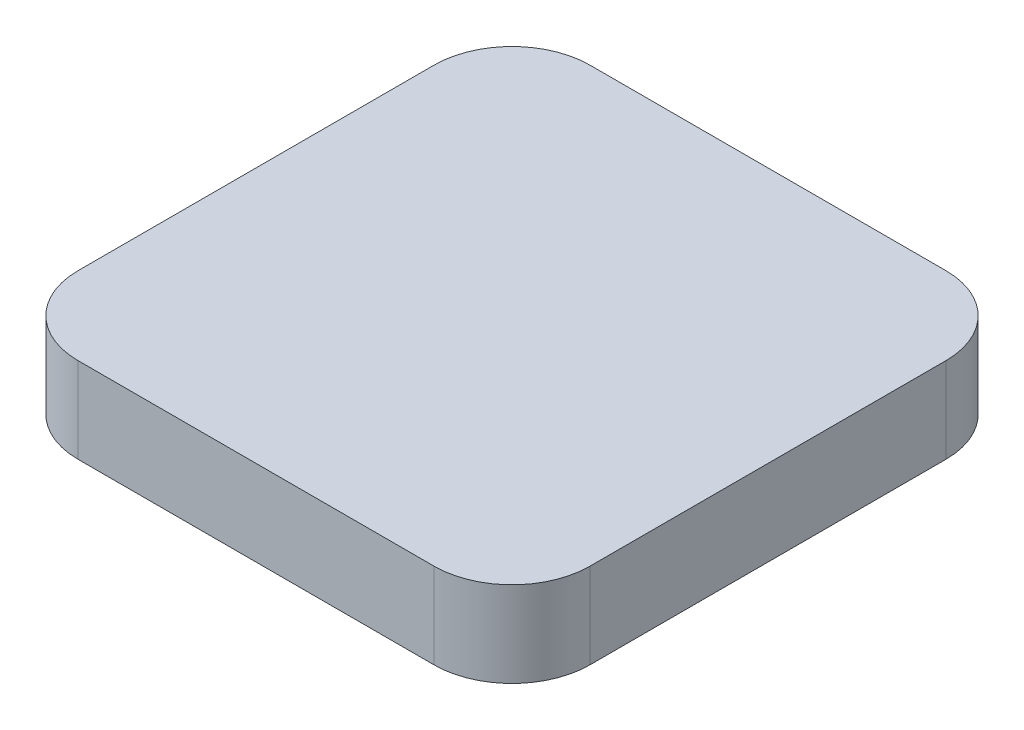
ISO-10303-21;
HEADER;
FILE_DESCRIPTION(('STEP AP214'),'2;1');
FILE_NAME('part.step','',(''),(''),'','','');
FILE_SCHEMA(('AUTOMOTIVE_DESIGN { 1 0 10303 214 1 1 1 1 }'));
ENDSEC;
DATA;
#1=APPLICATION_CONTEXT('core data for automotive mechanical design processes');
#2=APPLICATION_PROTOCOL_DEFINITION('international standard','automotive_design',2000,#1);
#3=PRODUCT_CONTEXT('',#1,'mechanical');
#4=PRODUCT('Part','Part','',(#3));
#5=PRODUCT_RELATED_PRODUCT_CATEGORY('part','',(#4));
#6=PRODUCT_DEFINITION_FORMATION('','',#4);
#7=PRODUCT_DEFINITION_CONTEXT('part definition',#1,'design');
#8=PRODUCT_DEFINITION('design','',#6,#7);
#9=PRODUCT_DEFINITION_SHAPE('','',#8);
#10=(LENGTH_UNIT() NAMED_UNIT(*) SI_UNIT(.MILLI.,.METRE.));
#11=(NAMED_UNIT(*) PLANE_ANGLE_UNIT() SI_UNIT($,.RADIAN.));
#12=(NAMED_UNIT(*) SI_UNIT($,.STERADIAN.) SOLID_ANGLE_UNIT());
#13=UNCERTAINTY_MEASURE_WITH_UNIT(LENGTH_MEASURE(1.E-05),#10,'distance_accuracy_value','');
#14=(GEOMETRIC_REPRESENTATION_CONTEXT(3) GLOBAL_UNCERTAINTY_ASSIGNED_CONTEXT((#13)) GLOBAL_UNIT_ASSIGNED_CONTEXT((#10,
#11,#12)) REPRESENTATION_CONTEXT('',''));
#15=CARTESIAN_POINT('',(0.,0.,0.));
#16=DIRECTION('',(0.,0.,1.));
#17=DIRECTION('',(1.,0.,0.));
#18=AXIS2_PLACEMENT_3D('',#15,#16,#17);
#19=CARTESIAN_POINT('',(-8.69949999999992,4.1783,8.69950000000003));
#20=DIRECTION('',(0.,-1.,0.));
#21=DIRECTION('',(0.,0.,-1.));
#22=AXIS2_PLACEMENT_3D('',#19,#20,#21);
#23=CYLINDRICAL_SURFACE('',#22,3.80999999999998);
#24=CARTESIAN_POINT('',(-8.69949999999992,0.,8.69950000000003));
#25=DIRECTION('',(0.,1.,0.));
#26=DIRECTION('',(0.,0.,-1.));
#27=AXIS2_PLACEMENT_3D('',#24,#25,#26);
#28=CIRCLE('',#27,3.80999999999998);
#29=CARTESIAN_POINT('',(-12.5094999999999,0.,8.69950000000003));
#30=VERTEX_POINT('',#29);
#31=CARTESIAN_POINT('',(-8.69949999999992,0.,12.5095));
#32=VERTEX_POINT('',#31);
#33=EDGE_CURVE('E128',#30,#32,#28,.T.);
#34=ORIENTED_EDGE('',*,*,#33,.T.);
#35=DIRECTION('',(0.,-1.,0.));
#36=VECTOR('',#35,1.);
#37=CARTESIAN_POINT('',(-8.69949999999992,4.1783,12.5095));
#38=LINE('',#37,#36);
#39=CARTESIAN_POINT('',(-8.69949999999992,4.1783,12.5095));
#40=VERTEX_POINT('',#39);
#41=EDGE_CURVE('E11',#40,#32,#38,.T.);
#42=ORIENTED_EDGE('',*,*,#41,.F.);
#43=CARTESIAN_POINT('',(-8.69949999999992,4.1783,8.69950000000003));
#44=DIRECTION('',(0.,1.,0.));
#45=DIRECTION('',(0.,0.,-1.));
#46=AXIS2_PLACEMENT_3D('',#43,#44,#45);
#47=CIRCLE('',#46,3.80999999999998);
#48=CARTESIAN_POINT('',(-12.5094999999999,4.1783,8.69950000000003));
#49=VERTEX_POINT('',#48);
#50=EDGE_CURVE('E142',#49,#40,#47,.T.);
#51=ORIENTED_EDGE('',*,*,#50,.F.);
#52=DIRECTION('',(0.,-1.,0.));
#53=VECTOR('',#52,1.);
#54=CARTESIAN_POINT('',(-12.5094999999999,4.1783,8.69950000000003));
#55=LINE('',#54,#53);
#56=EDGE_CURVE('E124',#49,#30,#55,.T.);
#57=ORIENTED_EDGE('',*,*,#56,.T.);
#58=EDGE_LOOP('',(#34,#42,#51,#57));
#59=FACE_BOUND('',#58,.T.);
#60=ADVANCED_FACE('F32',(#59),#23,.T.);
#61=CARTESIAN_POINT('',(-8.69949999999992,4.1783,12.5095));
#62=DIRECTION('',(0.,0.,-1.));
#63=DIRECTION('',(-1.,0.,0.));
#64=AXIS2_PLACEMENT_3D('',#61,#62,#63);
#65=PLANE('',#64);
#66=DIRECTION('',(1.,0.,0.));
#67=VECTOR('',#66,1.);
#68=CARTESIAN_POINT('',(-8.69949999999992,0.,12.5095));
#69=LINE('',#68,#67);
#70=CARTESIAN_POINT('',(8.69950000000014,0.,12.5095));
#71=VERTEX_POINT('',#70);
#72=EDGE_CURVE('E131',#32,#71,#69,.T.);
#73=ORIENTED_EDGE('',*,*,#72,.T.);
#74=DIRECTION('',(0.,-1.,0.));
#75=VECTOR('',#74,1.);
#76=CARTESIAN_POINT('',(8.69950000000014,4.1783,12.5095));
#77=LINE('',#76,#75);
#78=CARTESIAN_POINT('',(8.69950000000014,4.1783,12.5095));
#79=VERTEX_POINT('',#78);
#80=EDGE_CURVE('E40',#79,#71,#77,.T.);
#81=ORIENTED_EDGE('',*,*,#80,.F.);
#82=DIRECTION('',(1.,0.,0.));
#83=VECTOR('',#82,1.);
#84=CARTESIAN_POINT('',(-8.69949999999992,4.1783,12.5095));
#85=LINE('',#84,#83);
#86=EDGE_CURVE('E91',#40,#79,#85,.T.);
#87=ORIENTED_EDGE('',*,*,#86,.F.);
#88=ORIENTED_EDGE('',*,*,#41,.T.);
#89=EDGE_LOOP('',(#73,#81,#87,#88));
#90=FACE_BOUND('',#89,.T.);
#91=ADVANCED_FACE('F177',(#90),#65,.F.);
#92=CARTESIAN_POINT('',(8.69950000000014,4.1783,8.69950000000003));
#93=DIRECTION('',(0.,-1.,0.));
#94=DIRECTION('',(0.,0.,-1.));
#95=AXIS2_PLACEMENT_3D('',#92,#93,#94);
#96=CYLINDRICAL_SURFACE('',#95,3.80999999999998);
#97=CARTESIAN_POINT('',(8.69950000000014,0.,8.69950000000003));
#98=DIRECTION('',(0.,1.,0.));
#99=DIRECTION('',(0.,0.,1.));
#100=AXIS2_PLACEMENT_3D('',#97,#98,#99);
#101=CIRCLE('',#100,3.80999999999998);
#102=CARTESIAN_POINT('',(12.5095000000001,0.,8.69950000000003));
#103=VERTEX_POINT('',#102);
#104=EDGE_CURVE('E133',#71,#103,#101,.T.);
#105=ORIENTED_EDGE('',*,*,#104,.T.);
#106=DIRECTION('',(0.,-1.,0.));
#107=VECTOR('',#106,1.);
#108=CARTESIAN_POINT('',(12.5095000000001,4.1783,8.69950000000003));
#109=LINE('',#108,#107);
#110=CARTESIAN_POINT('',(12.5095000000001,4.1783,8.69950000000003));
#111=VERTEX_POINT('',#110);
#112=EDGE_CURVE('E149',#111,#103,#109,.T.);
#113=ORIENTED_EDGE('',*,*,#112,.F.);
#114=CARTESIAN_POINT('',(8.69950000000014,4.1783,8.69950000000003));
#115=DIRECTION('',(0.,1.,0.));
#116=DIRECTION('',(0.,0.,1.));
#117=AXIS2_PLACEMENT_3D('',#114,#115,#116);
#118=CIRCLE('',#117,3.80999999999998);
#119=EDGE_CURVE('E157',#79,#111,#118,.T.);
#120=ORIENTED_EDGE('',*,*,#119,.F.);
#121=ORIENTED_EDGE('',*,*,#80,.T.);
#122=EDGE_LOOP('',(#105,#113,#120,#121));
#123=FACE_BOUND('',#122,.T.);
#124=ADVANCED_FACE('F155',(#123),#96,.T.);
#125=CARTESIAN_POINT('',(12.5095000000001,4.1783,8.69950000000003));
#126=DIRECTION('',(-1.,0.,0.));
#127=DIRECTION('',(0.,0.,1.));
#128=AXIS2_PLACEMENT_3D('',#125,#126,#127);
#129=PLANE('',#128);
#130=DIRECTION('',(0.,0.,-1.));
#131=VECTOR('',#130,1.);
#132=CARTESIAN_POINT('',(12.5095000000001,0.,8.69950000000003));
#133=LINE('',#132,#131);
#134=CARTESIAN_POINT('',(12.5095000000001,0.,-8.69950000000003));
#135=VERTEX_POINT('',#134);
#136=EDGE_CURVE('E135',#103,#135,#133,.T.);
#137=ORIENTED_EDGE('',*,*,#136,.T.);
#138=DIRECTION('',(0.,-1.,0.));
#139=VECTOR('',#138,1.);
#140=CARTESIAN_POINT('',(12.5095000000001,4.1783,-8.69950000000003));
#141=LINE('',#140,#139);
#142=CARTESIAN_POINT('',(12.5095000000001,4.1783,-8.69950000000003));
#143=VERTEX_POINT('',#142);
#144=EDGE_CURVE('E146',#143,#135,#141,.T.);
#145=ORIENTED_EDGE('',*,*,#144,.F.);
#146=DIRECTION('',(0.,0.,-1.));
#147=VECTOR('',#146,1.);
#148=CARTESIAN_POINT('',(12.5095000000001,4.1783,8.69950000000003));
#149=LINE('',#148,#147);
#150=EDGE_CURVE('E169',#111,#143,#149,.T.);
#151=ORIENTED_EDGE('',*,*,#150,.F.);
#152=ORIENTED_EDGE('',*,*,#112,.T.);
#153=EDGE_LOOP('',(#137,#145,#151,#152));
#154=FACE_BOUND('',#153,.T.);
#155=ADVANCED_FACE('F165',(#154),#129,.F.);
#156=CARTESIAN_POINT('',(8.69950000000014,4.1783,-8.69950000000003));
#157=DIRECTION('',(0.,-1.,0.));
#158=DIRECTION('',(0.,0.,-1.));
#159=AXIS2_PLACEMENT_3D('',#156,#157,#158);
#160=CYLINDRICAL_SURFACE('',#159,3.80999999999998);
#161=CARTESIAN_POINT('',(8.69950000000014,0.,-8.69950000000003));
#162=DIRECTION('',(0.,1.,0.));
#163=DIRECTION('',(0.,0.,-1.));
#164=AXIS2_PLACEMENT_3D('',#161,#162,#163);
#165=CIRCLE('',#164,3.80999999999998);
#166=CARTESIAN_POINT('',(8.69950000000014,0.,-12.5095));
#167=VERTEX_POINT('',#166);
#168=EDGE_CURVE('E137',#135,#167,#165,.T.);
#169=ORIENTED_EDGE('',*,*,#168,.T.);
#170=DIRECTION('',(0.,-1.,0.));
#171=VECTOR('',#170,1.);
#172=CARTESIAN_POINT('',(8.69950000000014,4.1783,-12.5095));
#173=LINE('',#172,#171);
#174=CARTESIAN_POINT('',(8.69950000000014,4.1783,-12.5095));
#175=VERTEX_POINT('',#174);
#176=EDGE_CURVE('E119',#175,#167,#173,.T.);
#177=ORIENTED_EDGE('',*,*,#176,.F.);
#178=CARTESIAN_POINT('',(8.69950000000014,4.1783,-8.69950000000003));
#179=DIRECTION('',(0.,1.,0.));
#180=DIRECTION('',(0.,0.,-1.));
#181=AXIS2_PLACEMENT_3D('',#178,#179,#180);
#182=CIRCLE('',#181,3.80999999999998);
#183=EDGE_CURVE('E110',#143,#175,#182,.T.);
#184=ORIENTED_EDGE('',*,*,#183,.F.);
#185=ORIENTED_EDGE('',*,*,#144,.T.);
#186=EDGE_LOOP('',(#169,#177,#184,#185));
#187=FACE_BOUND('',#186,.T.);
#188=ADVANCED_FACE('F168',(#187),#160,.T.);
#189=CARTESIAN_POINT('',(-8.69949999999992,4.1783,-12.5095));
#190=DIRECTION('',(0.,0.,1.));
#191=DIRECTION('',(1.,0.,0.));
#192=AXIS2_PLACEMENT_3D('',#189,#190,#191);
#193=PLANE('',#192);
#194=DIRECTION('',(-1.,0.,0.));
#195=VECTOR('',#194,1.);
#196=CARTESIAN_POINT('',(-8.69949999999992,0.,-12.5095));
#197=LINE('',#196,#195);
#198=CARTESIAN_POINT('',(-8.69949999999992,0.,-12.5095));
#199=VERTEX_POINT('',#198);
#200=EDGE_CURVE('E118',#167,#199,#197,.T.);
#201=ORIENTED_EDGE('',*,*,#200,.T.);
#202=DIRECTION('',(0.,-1.,0.));
#203=VECTOR('',#202,1.);
#204=CARTESIAN_POINT('',(-8.69949999999992,4.1783,-12.5095));
#205=LINE('',#204,#203);
#206=CARTESIAN_POINT('',(-8.69949999999992,4.1783,-12.5095));
#207=VERTEX_POINT('',#206);
#208=EDGE_CURVE('E115',#207,#199,#205,.T.);
#209=ORIENTED_EDGE('',*,*,#208,.F.);
#210=DIRECTION('',(-1.,0.,0.));
#211=VECTOR('',#210,1.);
#212=CARTESIAN_POINT('',(-8.69949999999992,4.1783,-12.5095));
#213=LINE('',#212,#211);
#214=EDGE_CURVE('E104',#175,#207,#213,.T.);
#215=ORIENTED_EDGE('',*,*,#214,.F.);
#216=ORIENTED_EDGE('',*,*,#176,.T.);
#217=EDGE_LOOP('',(#201,#209,#215,#216));
#218=FACE_BOUND('',#217,.T.);
#219=ADVANCED_FACE('F116',(#218),#193,.F.);
#220=CARTESIAN_POINT('',(-8.69949999999992,4.1783,-8.69950000000003));
#221=DIRECTION('',(0.,-1.,0.));
#222=DIRECTION('',(0.,0.,-1.));
#223=AXIS2_PLACEMENT_3D('',#220,#221,#222);
#224=CYLINDRICAL_SURFACE('',#223,3.80999999999998);
#225=CARTESIAN_POINT('',(-8.69949999999992,0.,-8.69950000000003));
#226=DIRECTION('',(0.,1.,0.));
#227=DIRECTION('',(0.,0.,-1.));
#228=AXIS2_PLACEMENT_3D('',#225,#226,#227);
#229=CIRCLE('',#228,3.80999999999998);
#230=CARTESIAN_POINT('',(-12.5094999999999,0.,-8.69950000000003));
#231=VERTEX_POINT('',#230);
#232=EDGE_CURVE('E77',#199,#231,#229,.T.);
#233=ORIENTED_EDGE('',*,*,#232,.T.);
#234=DIRECTION('',(0.,-1.,0.));
#235=VECTOR('',#234,1.);
#236=CARTESIAN_POINT('',(-12.5094999999999,4.1783,-8.69950000000003));
#237=LINE('',#236,#235);
#238=CARTESIAN_POINT('',(-12.5094999999999,4.1783,-8.69950000000003));
#239=VERTEX_POINT('',#238);
#240=EDGE_CURVE('E120',#239,#231,#237,.T.);
#241=ORIENTED_EDGE('',*,*,#240,.F.);
#242=CARTESIAN_POINT('',(-8.69949999999992,4.1783,-8.69950000000003));
#243=DIRECTION('',(0.,1.,0.));
#244=DIRECTION('',(0.,0.,-1.));
#245=AXIS2_PLACEMENT_3D('',#242,#243,#244);
#246=CIRCLE('',#245,3.80999999999998);
#247=EDGE_CURVE('E108',#207,#239,#246,.T.);
#248=ORIENTED_EDGE('',*,*,#247,.F.);
#249=ORIENTED_EDGE('',*,*,#208,.T.);
#250=EDGE_LOOP('',(#233,#241,#248,#249));
#251=FACE_BOUND('',#250,.T.);
#252=ADVANCED_FACE('F122',(#251),#224,.T.);
#253=CARTESIAN_POINT('',(-12.5094999999999,4.1783,8.69950000000003));
#254=DIRECTION('',(1.,0.,0.));
#255=DIRECTION('',(0.,0.,-1.));
#256=AXIS2_PLACEMENT_3D('',#253,#254,#255);
#257=PLANE('',#256);
#258=DIRECTION('',(0.,0.,1.));
#259=VECTOR('',#258,1.);
#260=CARTESIAN_POINT('',(-12.5094999999999,0.,8.69950000000003));
#261=LINE('',#260,#259);
#262=EDGE_CURVE('E83',#231,#30,#261,.T.);
#263=ORIENTED_EDGE('',*,*,#262,.T.);
#264=ORIENTED_EDGE('',*,*,#56,.F.);
#265=DIRECTION('',(0.,0.,1.));
#266=VECTOR('',#265,1.);
#267=CARTESIAN_POINT('',(-12.5094999999999,4.1783,8.69950000000003));
#268=LINE('',#267,#266);
#269=EDGE_CURVE('E48',#239,#49,#268,.T.);
#270=ORIENTED_EDGE('',*,*,#269,.F.);
#271=ORIENTED_EDGE('',*,*,#240,.T.);
#272=EDGE_LOOP('',(#263,#264,#270,#271));
#273=FACE_BOUND('',#272,.T.);
#274=ADVANCED_FACE('F193',(#273),#257,.F.);
#275=CARTESIAN_POINT('',(-8.69949999999992,4.1783,8.69950000000003));
#276=DIRECTION('',(0.,-1.,0.));
#277=DIRECTION('',(0.,0.,-1.));
#278=AXIS2_PLACEMENT_3D('',#275,#276,#277);
#279=PLANE('',#278);
#280=ORIENTED_EDGE('',*,*,#50,.T.);
#281=ORIENTED_EDGE('',*,*,#86,.T.);
#282=ORIENTED_EDGE('',*,*,#119,.T.);
#283=ORIENTED_EDGE('',*,*,#150,.T.);
#284=ORIENTED_EDGE('',*,*,#183,.T.);
#285=ORIENTED_EDGE('',*,*,#214,.T.);
#286=ORIENTED_EDGE('',*,*,#247,.T.);
#287=ORIENTED_EDGE('',*,*,#269,.T.);
#288=EDGE_LOOP('',(#280,#281,#282,#283,#284,#285,#286,#287));
#289=FACE_BOUND('',#288,.T.);
#290=ADVANCED_FACE('F106',(#289),#279,.F.);
#291=CARTESIAN_POINT('',(-8.69949999999992,0.,8.69950000000003));
#292=DIRECTION('',(0.,-1.,0.));
#293=DIRECTION('',(0.,0.,-1.));
#294=AXIS2_PLACEMENT_3D('',#291,#292,#293);
#295=PLANE('',#294);
#296=ORIENTED_EDGE('',*,*,#33,.F.);
#297=ORIENTED_EDGE('',*,*,#262,.F.);
#298=ORIENTED_EDGE('',*,*,#232,.F.);
#299=ORIENTED_EDGE('',*,*,#200,.F.);
#300=ORIENTED_EDGE('',*,*,#168,.F.);
#301=ORIENTED_EDGE('',*,*,#136,.F.);
#302=ORIENTED_EDGE('',*,*,#104,.F.);
#303=ORIENTED_EDGE('',*,*,#72,.F.);
#304=EDGE_LOOP('',(#296,#297,#298,#299,#300,#301,#302,#303));
#305=FACE_BOUND('',#304,.T.);
#306=ADVANCED_FACE('F161',(#305),#295,.T.);
#307=CLOSED_SHELL('',(#60,#91,#124,#155,#188,#219,#252,#274,#290,#306));
#308=MANIFOLD_SOLID_BREP('B2',#307);
#309=ADVANCED_BREP_SHAPE_REPRESENTATION('',(#18,#308),#14);
#310=SHAPE_DEFINITION_REPRESENTATION(#9,#309);
ENDSEC;
END-ISO-10303-21;
